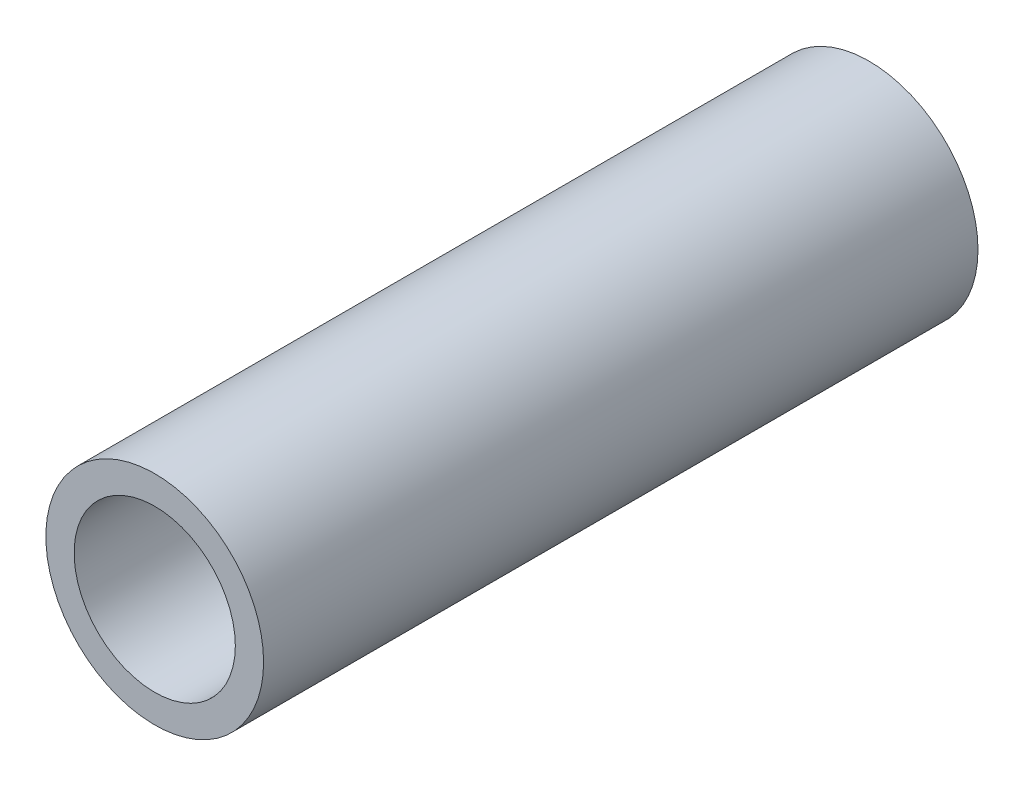
ISO-10303-21;
HEADER;
FILE_DESCRIPTION(('STEP AP214'),'2;1');
FILE_NAME('part.step','',(''),(''),'','','');
FILE_SCHEMA(('AUTOMOTIVE_DESIGN { 1 0 10303 214 1 1 1 1 }'));
ENDSEC;
DATA;
#1=APPLICATION_CONTEXT('core data for automotive mechanical design processes');
#2=APPLICATION_PROTOCOL_DEFINITION('international standard','automotive_design',2000,#1);
#3=PRODUCT_CONTEXT('',#1,'mechanical');
#4=PRODUCT('Part','Part','',(#3));
#5=PRODUCT_RELATED_PRODUCT_CATEGORY('part','',(#4));
#6=PRODUCT_DEFINITION_FORMATION('','',#4);
#7=PRODUCT_DEFINITION_CONTEXT('part definition',#1,'design');
#8=PRODUCT_DEFINITION('design','',#6,#7);
#9=PRODUCT_DEFINITION_SHAPE('','',#8);
#10=(LENGTH_UNIT() NAMED_UNIT(*) SI_UNIT(.MILLI.,.METRE.));
#11=(NAMED_UNIT(*) PLANE_ANGLE_UNIT() SI_UNIT($,.RADIAN.));
#12=(NAMED_UNIT(*) SI_UNIT($,.STERADIAN.) SOLID_ANGLE_UNIT());
#13=UNCERTAINTY_MEASURE_WITH_UNIT(LENGTH_MEASURE(1.E-05),#10,'distance_accuracy_value','');
#14=(GEOMETRIC_REPRESENTATION_CONTEXT(3) GLOBAL_UNCERTAINTY_ASSIGNED_CONTEXT((#13)) GLOBAL_UNIT_ASSIGNED_CONTEXT((#10,
#11,#12)) REPRESENTATION_CONTEXT('',''));
#15=CARTESIAN_POINT('',(0.,0.,0.));
#16=DIRECTION('',(0.,0.,1.));
#17=DIRECTION('',(1.,0.,0.));
#18=AXIS2_PLACEMENT_3D('',#15,#16,#17);
#19=CARTESIAN_POINT('',(0.,0.,35.));
#20=DIRECTION('',(0.,0.,1.));
#21=DIRECTION('',(1.,0.,0.));
#22=AXIS2_PLACEMENT_3D('',#19,#20,#21);
#23=PLANE('',#22);
#24=CARTESIAN_POINT('',(0.,0.,35.));
#25=DIRECTION('',(0.,0.,1.));
#26=DIRECTION('',(1.,0.,0.));
#27=AXIS2_PLACEMENT_3D('',#24,#25,#26);
#28=CIRCLE('',#27,10.668);
#29=CARTESIAN_POINT('',(10.668,0.,35.));
#30=VERTEX_POINT('',#29);
#31=EDGE_CURVE('E11',#30,#30,#28,.T.);
#32=ORIENTED_EDGE('',*,*,#31,.T.);
#33=EDGE_LOOP('',(#32));
#34=FACE_BOUND('',#33,.T.);
#35=CARTESIAN_POINT('',(0.,0.,35.));
#36=DIRECTION('',(0.,0.,1.));
#37=DIRECTION('',(1.,0.,0.));
#38=AXIS2_PLACEMENT_3D('',#35,#36,#37);
#39=CIRCLE('',#38,7.8994);
#40=CARTESIAN_POINT('',(7.8994,0.,35.));
#41=VERTEX_POINT('',#40);
#42=EDGE_CURVE('E56',#41,#41,#39,.T.);
#43=ORIENTED_EDGE('',*,*,#42,.F.);
#44=EDGE_LOOP('',(#43));
#45=FACE_BOUND('',#44,.T.);
#46=ADVANCED_FACE('F43',(#34,#45),#23,.T.);
#47=CARTESIAN_POINT('',(0.,0.,-35.));
#48=DIRECTION('',(0.,0.,1.));
#49=DIRECTION('',(1.,0.,0.));
#50=AXIS2_PLACEMENT_3D('',#47,#48,#49);
#51=PLANE('',#50);
#52=CARTESIAN_POINT('',(0.,0.,-35.));
#53=DIRECTION('',(0.,0.,1.));
#54=DIRECTION('',(1.,0.,0.));
#55=AXIS2_PLACEMENT_3D('',#52,#53,#54);
#56=CIRCLE('',#55,10.668);
#57=CARTESIAN_POINT('',(10.668,0.,-35.));
#58=VERTEX_POINT('',#57);
#59=EDGE_CURVE('E47',#58,#58,#56,.T.);
#60=ORIENTED_EDGE('',*,*,#59,.F.);
#61=EDGE_LOOP('',(#60));
#62=FACE_BOUND('',#61,.T.);
#63=CARTESIAN_POINT('',(0.,0.,-35.));
#64=DIRECTION('',(0.,0.,1.));
#65=DIRECTION('',(1.,0.,0.));
#66=AXIS2_PLACEMENT_3D('',#63,#64,#65);
#67=CIRCLE('',#66,7.8994);
#68=CARTESIAN_POINT('',(7.8994,0.,-35.));
#69=VERTEX_POINT('',#68);
#70=EDGE_CURVE('E58',#69,#69,#67,.T.);
#71=ORIENTED_EDGE('',*,*,#70,.T.);
#72=EDGE_LOOP('',(#71));
#73=FACE_BOUND('',#72,.T.);
#74=ADVANCED_FACE('F70',(#62,#73),#51,.F.);
#75=CARTESIAN_POINT('',(0.,0.,35.));
#76=DIRECTION('',(0.,0.,-1.));
#77=DIRECTION('',(-1.,0.,0.));
#78=AXIS2_PLACEMENT_3D('',#75,#76,#77);
#79=CYLINDRICAL_SURFACE('',#78,10.668);
#80=ORIENTED_EDGE('',*,*,#31,.F.);
#81=EDGE_LOOP('',(#80));
#82=FACE_BOUND('',#81,.T.);
#83=ORIENTED_EDGE('',*,*,#59,.T.);
#84=EDGE_LOOP('',(#83));
#85=FACE_BOUND('',#84,.T.);
#86=ADVANCED_FACE('F45',(#82,#85),#79,.T.);
#87=CARTESIAN_POINT('',(0.,0.,35.));
#88=DIRECTION('',(0.,0.,-1.));
#89=DIRECTION('',(-1.,0.,0.));
#90=AXIS2_PLACEMENT_3D('',#87,#88,#89);
#91=CYLINDRICAL_SURFACE('',#90,7.8994);
#92=ORIENTED_EDGE('',*,*,#42,.T.);
#93=EDGE_LOOP('',(#92));
#94=FACE_BOUND('',#93,.T.);
#95=ORIENTED_EDGE('',*,*,#70,.F.);
#96=EDGE_LOOP('',(#95));
#97=FACE_BOUND('',#96,.T.);
#98=ADVANCED_FACE('F66',(#94,#97),#91,.F.);
#99=CLOSED_SHELL('',(#46,#74,#86,#98));
#100=MANIFOLD_SOLID_BREP('B2',#99);
#101=ADVANCED_BREP_SHAPE_REPRESENTATION('',(#18,#100),#14);
#102=SHAPE_DEFINITION_REPRESENTATION(#9,#101);
ENDSEC;
END-ISO-10303-21;
